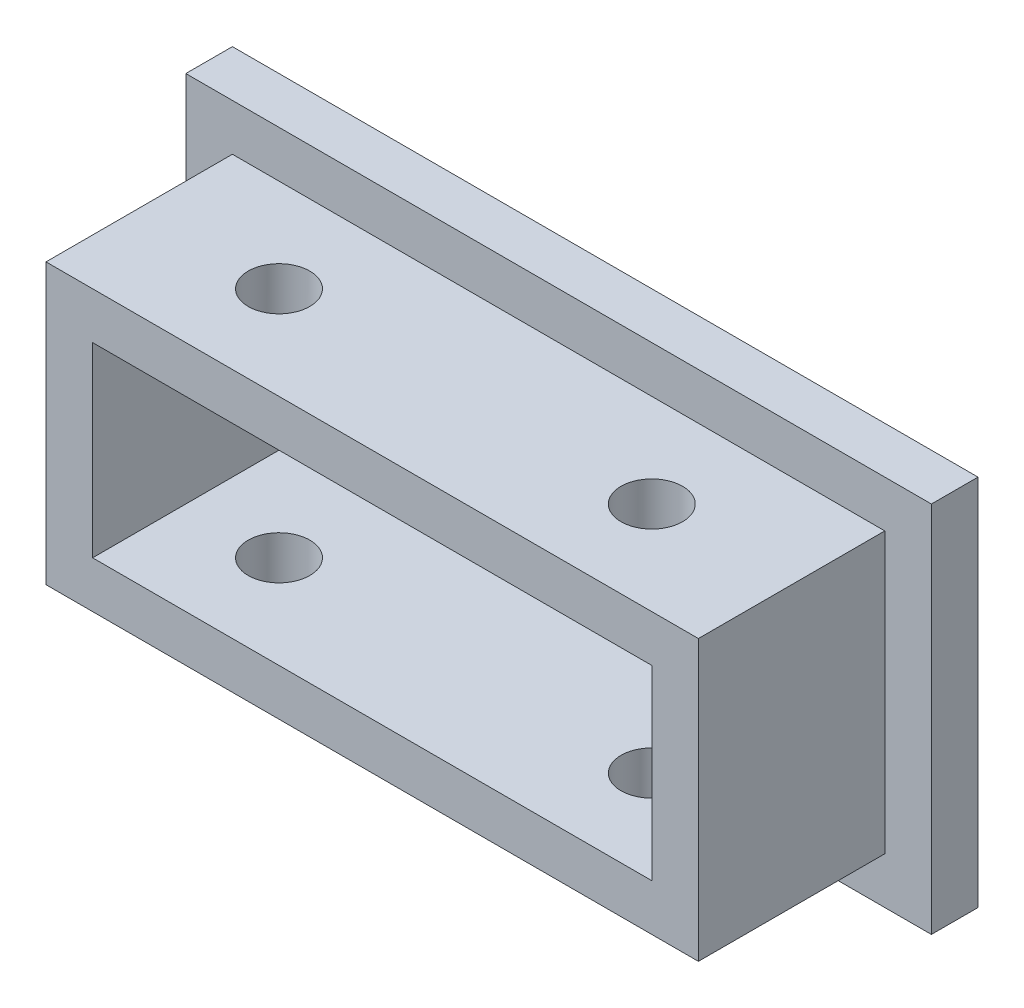
ISO-10303-21;
HEADER;
FILE_DESCRIPTION(('STEP AP214'),'2;1');
FILE_NAME('part.step','',(''),(''),'','','');
FILE_SCHEMA(('AUTOMOTIVE_DESIGN { 1 0 10303 214 1 1 1 1 }'));
ENDSEC;
DATA;
#1=APPLICATION_CONTEXT('core data for automotive mechanical design processes');
#2=APPLICATION_PROTOCOL_DEFINITION('international standard','automotive_design',2000,#1);
#3=PRODUCT_CONTEXT('',#1,'mechanical');
#4=PRODUCT('Part','Part','',(#3));
#5=PRODUCT_RELATED_PRODUCT_CATEGORY('part','',(#4));
#6=PRODUCT_DEFINITION_FORMATION('','',#4);
#7=PRODUCT_DEFINITION_CONTEXT('part definition',#1,'design');
#8=PRODUCT_DEFINITION('design','',#6,#7);
#9=PRODUCT_DEFINITION_SHAPE('','',#8);
#10=(LENGTH_UNIT() NAMED_UNIT(*) SI_UNIT(.MILLI.,.METRE.));
#11=(NAMED_UNIT(*) PLANE_ANGLE_UNIT() SI_UNIT($,.RADIAN.));
#12=(NAMED_UNIT(*) SI_UNIT($,.STERADIAN.) SOLID_ANGLE_UNIT());
#13=UNCERTAINTY_MEASURE_WITH_UNIT(LENGTH_MEASURE(1.E-05),#10,'distance_accuracy_value','');
#14=(GEOMETRIC_REPRESENTATION_CONTEXT(3) GLOBAL_UNCERTAINTY_ASSIGNED_CONTEXT((#13)) GLOBAL_UNIT_ASSIGNED_CONTEXT((#10,
#11,#12)) REPRESENTATION_CONTEXT('',''));
#15=CARTESIAN_POINT('',(0.,0.,0.));
#16=DIRECTION('',(0.,0.,1.));
#17=DIRECTION('',(1.,0.,0.));
#18=AXIS2_PLACEMENT_3D('',#15,#16,#17);
#19=CARTESIAN_POINT('',(0.,0.,12.7));
#20=DIRECTION('',(0.,0.,1.));
#21=DIRECTION('',(1.,0.,0.));
#22=AXIS2_PLACEMENT_3D('',#19,#20,#21);
#23=PLANE('',#22);
#24=DIRECTION('',(0.,1.,0.));
#25=VECTOR('',#24,1.);
#26=CARTESIAN_POINT('',(22.225,9.525,12.7));
#27=LINE('',#26,#25);
#28=CARTESIAN_POINT('',(22.225,-9.52500000000001,12.7));
#29=VERTEX_POINT('',#28);
#30=CARTESIAN_POINT('',(22.225,9.525,12.7));
#31=VERTEX_POINT('',#30);
#32=EDGE_CURVE('E110',#29,#31,#27,.T.);
#33=ORIENTED_EDGE('',*,*,#32,.T.);
#34=DIRECTION('',(-1.,0.,0.));
#35=VECTOR('',#34,1.);
#36=CARTESIAN_POINT('',(-22.225,9.525,12.7));
#37=LINE('',#36,#35);
#38=CARTESIAN_POINT('',(-22.225,9.525,12.7));
#39=VERTEX_POINT('',#38);
#40=EDGE_CURVE('E103',#31,#39,#37,.T.);
#41=ORIENTED_EDGE('',*,*,#40,.T.);
#42=DIRECTION('',(0.,-1.,0.));
#43=VECTOR('',#42,1.);
#44=CARTESIAN_POINT('',(-22.225,9.525,12.7));
#45=LINE('',#44,#43);
#46=CARTESIAN_POINT('',(-22.225,-9.52500000000001,12.7));
#47=VERTEX_POINT('',#46);
#48=EDGE_CURVE('E107',#39,#47,#45,.T.);
#49=ORIENTED_EDGE('',*,*,#48,.T.);
#50=DIRECTION('',(1.,0.,0.));
#51=VECTOR('',#50,1.);
#52=CARTESIAN_POINT('',(-22.225,-9.52500000000001,12.7));
#53=LINE('',#52,#51);
#54=EDGE_CURVE('E66',#47,#29,#53,.T.);
#55=ORIENTED_EDGE('',*,*,#54,.T.);
#56=EDGE_LOOP('',(#33,#41,#49,#55));
#57=FACE_BOUND('',#56,.T.);
#58=DIRECTION('',(1.,0.,0.));
#59=VECTOR('',#58,1.);
#60=CARTESIAN_POINT('',(-19.05,-6.35000000000001,12.7));
#61=LINE('',#60,#59);
#62=CARTESIAN_POINT('',(-19.05,-6.35000000000001,12.7));
#63=VERTEX_POINT('',#62);
#64=CARTESIAN_POINT('',(19.05,-6.35000000000001,12.7));
#65=VERTEX_POINT('',#64);
#66=EDGE_CURVE('E187',#63,#65,#61,.T.);
#67=ORIENTED_EDGE('',*,*,#66,.F.);
#68=DIRECTION('',(0.,-1.,0.));
#69=VECTOR('',#68,1.);
#70=CARTESIAN_POINT('',(-19.05,6.35,12.7));
#71=LINE('',#70,#69);
#72=CARTESIAN_POINT('',(-19.05,6.35,12.7));
#73=VERTEX_POINT('',#72);
#74=EDGE_CURVE('E183',#73,#63,#71,.T.);
#75=ORIENTED_EDGE('',*,*,#74,.F.);
#76=DIRECTION('',(-1.,0.,0.));
#77=VECTOR('',#76,1.);
#78=CARTESIAN_POINT('',(-19.05,6.35,12.7));
#79=LINE('',#78,#77);
#80=CARTESIAN_POINT('',(19.05,6.35,12.7));
#81=VERTEX_POINT('',#80);
#82=EDGE_CURVE('E87',#81,#73,#79,.T.);
#83=ORIENTED_EDGE('',*,*,#82,.F.);
#84=DIRECTION('',(0.,1.,0.));
#85=VECTOR('',#84,1.);
#86=CARTESIAN_POINT('',(19.05,6.35,12.7));
#87=LINE('',#86,#85);
#88=EDGE_CURVE('E191',#65,#81,#87,.T.);
#89=ORIENTED_EDGE('',*,*,#88,.F.);
#90=EDGE_LOOP('',(#67,#75,#83,#89));
#91=FACE_BOUND('',#90,.T.);
#92=ADVANCED_FACE('F39',(#57,#91),#23,.T.);
#93=CARTESIAN_POINT('',(22.225,9.525,12.7));
#94=DIRECTION('',(-1.,0.,0.));
#95=DIRECTION('',(0.,-1.,0.));
#96=AXIS2_PLACEMENT_3D('',#93,#94,#95);
#97=PLANE('',#96);
#98=DIRECTION('',(0.,1.,0.));
#99=VECTOR('',#98,1.);
#100=CARTESIAN_POINT('',(22.225,9.525,0.));
#101=LINE('',#100,#99);
#102=CARTESIAN_POINT('',(22.225,-9.52500000000001,0.));
#103=VERTEX_POINT('',#102);
#104=CARTESIAN_POINT('',(22.225,9.525,0.));
#105=VERTEX_POINT('',#104);
#106=EDGE_CURVE('E131',#103,#105,#101,.T.);
#107=ORIENTED_EDGE('',*,*,#106,.T.);
#108=DIRECTION('',(0.,0.,-1.));
#109=VECTOR('',#108,1.);
#110=CARTESIAN_POINT('',(22.225,9.525,12.7));
#111=LINE('',#110,#109);
#112=EDGE_CURVE('E11',#31,#105,#111,.T.);
#113=ORIENTED_EDGE('',*,*,#112,.F.);
#114=ORIENTED_EDGE('',*,*,#32,.F.);
#115=DIRECTION('',(0.,0.,-1.));
#116=VECTOR('',#115,1.);
#117=CARTESIAN_POINT('',(22.225,-9.52500000000001,12.7));
#118=LINE('',#117,#116);
#119=EDGE_CURVE('E127',#29,#103,#118,.T.);
#120=ORIENTED_EDGE('',*,*,#119,.T.);
#121=EDGE_LOOP('',(#107,#113,#114,#120));
#122=FACE_BOUND('',#121,.T.);
#123=ADVANCED_FACE('F41',(#122),#97,.F.);
#124=CARTESIAN_POINT('',(-22.225,9.525,12.7));
#125=DIRECTION('',(0.,-1.,0.));
#126=DIRECTION('',(0.,0.,-1.));
#127=AXIS2_PLACEMENT_3D('',#124,#125,#126);
#128=PLANE('',#127);
#129=CARTESIAN_POINT('',(-12.7,9.525,6.35));
#130=DIRECTION('',(0.,1.,0.));
#131=DIRECTION('',(0.,0.,1.));
#132=AXIS2_PLACEMENT_3D('',#129,#130,#131);
#133=CIRCLE('',#132,2.0955);
#134=CARTESIAN_POINT('',(-12.7,9.525,8.4455));
#135=VERTEX_POINT('',#134);
#136=EDGE_CURVE('E160',#135,#135,#133,.T.);
#137=ORIENTED_EDGE('',*,*,#136,.F.);
#138=EDGE_LOOP('',(#137));
#139=FACE_BOUND('',#138,.T.);
#140=CARTESIAN_POINT('',(12.7,9.525,6.35));
#141=DIRECTION('',(0.,1.,0.));
#142=DIRECTION('',(0.,0.,-1.));
#143=AXIS2_PLACEMENT_3D('',#140,#141,#142);
#144=CIRCLE('',#143,2.0955);
#145=CARTESIAN_POINT('',(12.7,9.525,4.2545));
#146=VERTEX_POINT('',#145);
#147=EDGE_CURVE('E170',#146,#146,#144,.T.);
#148=ORIENTED_EDGE('',*,*,#147,.F.);
#149=EDGE_LOOP('',(#148));
#150=FACE_BOUND('',#149,.T.);
#151=DIRECTION('',(-1.,0.,0.));
#152=VECTOR('',#151,1.);
#153=CARTESIAN_POINT('',(-22.225,9.525,0.));
#154=LINE('',#153,#152);
#155=CARTESIAN_POINT('',(-22.225,9.525,0.));
#156=VERTEX_POINT('',#155);
#157=EDGE_CURVE('E117',#105,#156,#154,.T.);
#158=ORIENTED_EDGE('',*,*,#157,.T.);
#159=DIRECTION('',(0.,0.,-1.));
#160=VECTOR('',#159,1.);
#161=CARTESIAN_POINT('',(-22.225,9.525,12.7));
#162=LINE('',#161,#160);
#163=EDGE_CURVE('E49',#39,#156,#162,.T.);
#164=ORIENTED_EDGE('',*,*,#163,.F.);
#165=ORIENTED_EDGE('',*,*,#40,.F.);
#166=ORIENTED_EDGE('',*,*,#112,.T.);
#167=EDGE_LOOP('',(#158,#164,#165,#166));
#168=FACE_BOUND('',#167,.T.);
#169=ADVANCED_FACE('F116',(#139,#150,#168),#128,.F.);
#170=CARTESIAN_POINT('',(-22.225,9.525,12.7));
#171=DIRECTION('',(1.,0.,0.));
#172=DIRECTION('',(0.,1.,0.));
#173=AXIS2_PLACEMENT_3D('',#170,#171,#172);
#174=PLANE('',#173);
#175=DIRECTION('',(0.,-1.,0.));
#176=VECTOR('',#175,1.);
#177=CARTESIAN_POINT('',(-22.225,9.525,0.));
#178=LINE('',#177,#176);
#179=CARTESIAN_POINT('',(-22.225,-9.52500000000001,0.));
#180=VERTEX_POINT('',#179);
#181=EDGE_CURVE('E79',#156,#180,#178,.T.);
#182=ORIENTED_EDGE('',*,*,#181,.T.);
#183=DIRECTION('',(0.,0.,-1.));
#184=VECTOR('',#183,1.);
#185=CARTESIAN_POINT('',(-22.225,-9.52500000000001,12.7));
#186=LINE('',#185,#184);
#187=EDGE_CURVE('E120',#47,#180,#186,.T.);
#188=ORIENTED_EDGE('',*,*,#187,.F.);
#189=ORIENTED_EDGE('',*,*,#48,.F.);
#190=ORIENTED_EDGE('',*,*,#163,.T.);
#191=EDGE_LOOP('',(#182,#188,#189,#190));
#192=FACE_BOUND('',#191,.T.);
#193=ADVANCED_FACE('F122',(#192),#174,.F.);
#194=CARTESIAN_POINT('',(-22.225,-9.52500000000001,12.7));
#195=DIRECTION('',(0.,1.,0.));
#196=DIRECTION('',(0.,0.,1.));
#197=AXIS2_PLACEMENT_3D('',#194,#195,#196);
#198=PLANE('',#197);
#199=CARTESIAN_POINT('',(-12.7,-9.52500000000001,6.35));
#200=DIRECTION('',(0.,1.,0.));
#201=DIRECTION('',(0.,0.,1.));
#202=AXIS2_PLACEMENT_3D('',#199,#200,#201);
#203=CIRCLE('',#202,2.0955);
#204=CARTESIAN_POINT('',(-12.7,-9.52500000000001,8.4455));
#205=VERTEX_POINT('',#204);
#206=EDGE_CURVE('E152',#205,#205,#203,.F.);
#207=ORIENTED_EDGE('',*,*,#206,.F.);
#208=EDGE_LOOP('',(#207));
#209=FACE_BOUND('',#208,.T.);
#210=CARTESIAN_POINT('',(12.7,-9.52500000000001,6.35));
#211=DIRECTION('',(0.,1.,0.));
#212=DIRECTION('',(0.,0.,1.));
#213=AXIS2_PLACEMENT_3D('',#210,#211,#212);
#214=CIRCLE('',#213,2.0955);
#215=CARTESIAN_POINT('',(12.7,-9.52500000000001,8.4455));
#216=VERTEX_POINT('',#215);
#217=EDGE_CURVE('E166',#216,#216,#214,.F.);
#218=ORIENTED_EDGE('',*,*,#217,.F.);
#219=EDGE_LOOP('',(#218));
#220=FACE_BOUND('',#219,.T.);
#221=DIRECTION('',(1.,0.,0.));
#222=VECTOR('',#221,1.);
#223=CARTESIAN_POINT('',(-22.225,-9.52500000000001,0.));
#224=LINE('',#223,#222);
#225=EDGE_CURVE('E140',#180,#103,#224,.T.);
#226=ORIENTED_EDGE('',*,*,#225,.T.);
#227=ORIENTED_EDGE('',*,*,#119,.F.);
#228=ORIENTED_EDGE('',*,*,#54,.F.);
#229=ORIENTED_EDGE('',*,*,#187,.T.);
#230=EDGE_LOOP('',(#226,#227,#228,#229));
#231=FACE_BOUND('',#230,.T.);
#232=ADVANCED_FACE('F257',(#209,#220,#231),#198,.F.);
#233=CARTESIAN_POINT('',(-19.05,6.35,12.7));
#234=DIRECTION('',(1.,0.,0.));
#235=DIRECTION('',(0.,0.,-1.));
#236=AXIS2_PLACEMENT_3D('',#233,#234,#235);
#237=PLANE('',#236);
#238=DIRECTION('',(0.,-1.,0.));
#239=VECTOR('',#238,1.);
#240=CARTESIAN_POINT('',(-19.05,6.35,0.));
#241=LINE('',#240,#239);
#242=CARTESIAN_POINT('',(-19.05,6.35,0.));
#243=VERTEX_POINT('',#242);
#244=CARTESIAN_POINT('',(-19.05,-6.35000000000001,0.));
#245=VERTEX_POINT('',#244);
#246=EDGE_CURVE('E182',#243,#245,#241,.T.);
#247=ORIENTED_EDGE('',*,*,#246,.F.);
#248=DIRECTION('',(0.,0.,-1.));
#249=VECTOR('',#248,1.);
#250=CARTESIAN_POINT('',(-19.05,6.35,12.7));
#251=LINE('',#250,#249);
#252=EDGE_CURVE('E196',#73,#243,#251,.T.);
#253=ORIENTED_EDGE('',*,*,#252,.F.);
#254=ORIENTED_EDGE('',*,*,#74,.T.);
#255=DIRECTION('',(0.,0.,-1.));
#256=VECTOR('',#255,1.);
#257=CARTESIAN_POINT('',(-19.05,-6.35000000000001,12.7));
#258=LINE('',#257,#256);
#259=EDGE_CURVE('E135',#63,#245,#258,.T.);
#260=ORIENTED_EDGE('',*,*,#259,.T.);
#261=EDGE_LOOP('',(#247,#253,#254,#260));
#262=FACE_BOUND('',#261,.T.);
#263=ADVANCED_FACE('F246',(#262),#237,.T.);
#264=CARTESIAN_POINT('',(-19.05,-6.35000000000001,12.7));
#265=DIRECTION('',(0.,1.,0.));
#266=DIRECTION('',(0.,0.,1.));
#267=AXIS2_PLACEMENT_3D('',#264,#265,#266);
#268=PLANE('',#267);
#269=CARTESIAN_POINT('',(-12.7,-6.35,6.35));
#270=DIRECTION('',(0.,1.,0.));
#271=DIRECTION('',(0.,0.,1.));
#272=AXIS2_PLACEMENT_3D('',#269,#270,#271);
#273=CIRCLE('',#272,2.0955);
#274=CARTESIAN_POINT('',(-12.7,-6.35,8.4455));
#275=VERTEX_POINT('',#274);
#276=EDGE_CURVE('E178',#275,#275,#273,.T.);
#277=ORIENTED_EDGE('',*,*,#276,.F.);
#278=EDGE_LOOP('',(#277));
#279=FACE_BOUND('',#278,.T.);
#280=CARTESIAN_POINT('',(12.7,-6.35,6.35));
#281=DIRECTION('',(0.,1.,0.));
#282=DIRECTION('',(0.,0.,1.));
#283=AXIS2_PLACEMENT_3D('',#280,#281,#282);
#284=CIRCLE('',#283,2.0955);
#285=CARTESIAN_POINT('',(12.7,-6.35,8.4455));
#286=VERTEX_POINT('',#285);
#287=EDGE_CURVE('E151',#286,#286,#284,.T.);
#288=ORIENTED_EDGE('',*,*,#287,.F.);
#289=EDGE_LOOP('',(#288));
#290=FACE_BOUND('',#289,.T.);
#291=DIRECTION('',(1.,0.,0.));
#292=VECTOR('',#291,1.);
#293=CARTESIAN_POINT('',(-19.05,-6.35000000000001,0.));
#294=LINE('',#293,#292);
#295=CARTESIAN_POINT('',(19.05,-6.35000000000001,0.));
#296=VERTEX_POINT('',#295);
#297=EDGE_CURVE('E200',#245,#296,#294,.T.);
#298=ORIENTED_EDGE('',*,*,#297,.F.);
#299=ORIENTED_EDGE('',*,*,#259,.F.);
#300=ORIENTED_EDGE('',*,*,#66,.T.);
#301=DIRECTION('',(0.,0.,-1.));
#302=VECTOR('',#301,1.);
#303=CARTESIAN_POINT('',(19.05,-6.35000000000001,12.7));
#304=LINE('',#303,#302);
#305=EDGE_CURVE('E215',#65,#296,#304,.T.);
#306=ORIENTED_EDGE('',*,*,#305,.T.);
#307=EDGE_LOOP('',(#298,#299,#300,#306));
#308=FACE_BOUND('',#307,.T.);
#309=ADVANCED_FACE('F248',(#279,#290,#308),#268,.T.);
#310=CARTESIAN_POINT('',(19.05,6.35,12.7));
#311=DIRECTION('',(-1.,0.,0.));
#312=DIRECTION('',(0.,0.,1.));
#313=AXIS2_PLACEMENT_3D('',#310,#311,#312);
#314=PLANE('',#313);
#315=DIRECTION('',(0.,1.,0.));
#316=VECTOR('',#315,1.);
#317=CARTESIAN_POINT('',(19.05,6.35,0.));
#318=LINE('',#317,#316);
#319=CARTESIAN_POINT('',(19.05,6.35,0.));
#320=VERTEX_POINT('',#319);
#321=EDGE_CURVE('E204',#296,#320,#318,.T.);
#322=ORIENTED_EDGE('',*,*,#321,.F.);
#323=ORIENTED_EDGE('',*,*,#305,.F.);
#324=ORIENTED_EDGE('',*,*,#88,.T.);
#325=DIRECTION('',(0.,0.,-1.));
#326=VECTOR('',#325,1.);
#327=CARTESIAN_POINT('',(19.05,6.35,12.7));
#328=LINE('',#327,#326);
#329=EDGE_CURVE('E57',#81,#320,#328,.T.);
#330=ORIENTED_EDGE('',*,*,#329,.T.);
#331=EDGE_LOOP('',(#322,#323,#324,#330));
#332=FACE_BOUND('',#331,.T.);
#333=ADVANCED_FACE('F232',(#332),#314,.T.);
#334=CARTESIAN_POINT('',(-19.05,6.35,12.7));
#335=DIRECTION('',(0.,-1.,0.));
#336=DIRECTION('',(0.,0.,-1.));
#337=AXIS2_PLACEMENT_3D('',#334,#335,#336);
#338=PLANE('',#337);
#339=CARTESIAN_POINT('',(-12.7,6.34999999999999,6.35));
#340=DIRECTION('',(0.,-1.,0.));
#341=DIRECTION('',(0.,0.,-1.));
#342=AXIS2_PLACEMENT_3D('',#339,#340,#341);
#343=CIRCLE('',#342,2.0955);
#344=CARTESIAN_POINT('',(-12.7,6.34999999999999,4.2545));
#345=VERTEX_POINT('',#344);
#346=EDGE_CURVE('E43',#345,#345,#343,.T.);
#347=ORIENTED_EDGE('',*,*,#346,.F.);
#348=EDGE_LOOP('',(#347));
#349=FACE_BOUND('',#348,.T.);
#350=CARTESIAN_POINT('',(12.7,6.34999999999999,6.35));
#351=DIRECTION('',(0.,-1.,0.));
#352=DIRECTION('',(0.,0.,-1.));
#353=AXIS2_PLACEMENT_3D('',#350,#351,#352);
#354=CIRCLE('',#353,2.0955);
#355=CARTESIAN_POINT('',(12.7,6.34999999999999,4.2545));
#356=VERTEX_POINT('',#355);
#357=EDGE_CURVE('E148',#356,#356,#354,.T.);
#358=ORIENTED_EDGE('',*,*,#357,.F.);
#359=EDGE_LOOP('',(#358));
#360=FACE_BOUND('',#359,.T.);
#361=DIRECTION('',(-1.,0.,0.));
#362=VECTOR('',#361,1.);
#363=CARTESIAN_POINT('',(-19.05,6.35,0.));
#364=LINE('',#363,#362);
#365=EDGE_CURVE('E188',#320,#243,#364,.T.);
#366=ORIENTED_EDGE('',*,*,#365,.F.);
#367=ORIENTED_EDGE('',*,*,#329,.F.);
#368=ORIENTED_EDGE('',*,*,#82,.T.);
#369=ORIENTED_EDGE('',*,*,#252,.T.);
#370=EDGE_LOOP('',(#366,#367,#368,#369));
#371=FACE_BOUND('',#370,.T.);
#372=ADVANCED_FACE('F228',(#349,#360,#371),#338,.T.);
#373=CARTESIAN_POINT('',(12.7,-15.4519690399056,6.35));
#374=DIRECTION('',(0.,1.,0.));
#375=DIRECTION('',(0.,0.,1.));
#376=AXIS2_PLACEMENT_3D('',#373,#374,#375);
#377=CYLINDRICAL_SURFACE('',#376,2.0955);
#378=ORIENTED_EDGE('',*,*,#357,.T.);
#379=EDGE_LOOP('',(#378));
#380=FACE_BOUND('',#379,.T.);
#381=ORIENTED_EDGE('',*,*,#147,.T.);
#382=EDGE_LOOP('',(#381));
#383=FACE_BOUND('',#382,.T.);
#384=ADVANCED_FACE('F231',(#380,#383),#377,.F.);
#385=CARTESIAN_POINT('',(-12.7,-15.4519690399056,6.35));
#386=DIRECTION('',(0.,1.,0.));
#387=DIRECTION('',(0.,0.,1.));
#388=AXIS2_PLACEMENT_3D('',#385,#386,#387);
#389=CYLINDRICAL_SURFACE('',#388,2.0955);
#390=ORIENTED_EDGE('',*,*,#346,.T.);
#391=EDGE_LOOP('',(#390));
#392=FACE_BOUND('',#391,.T.);
#393=ORIENTED_EDGE('',*,*,#136,.T.);
#394=EDGE_LOOP('',(#393));
#395=FACE_BOUND('',#394,.T.);
#396=ADVANCED_FACE('F225',(#392,#395),#389,.F.);
#397=ORIENTED_EDGE('',*,*,#287,.T.);
#398=EDGE_LOOP('',(#397));
#399=FACE_BOUND('',#398,.T.);
#400=ORIENTED_EDGE('',*,*,#217,.T.);
#401=EDGE_LOOP('',(#400));
#402=FACE_BOUND('',#401,.T.);
#403=ADVANCED_FACE('F282',(#399,#402),#377,.F.);
#404=ORIENTED_EDGE('',*,*,#276,.T.);
#405=EDGE_LOOP('',(#404));
#406=FACE_BOUND('',#405,.T.);
#407=ORIENTED_EDGE('',*,*,#206,.T.);
#408=EDGE_LOOP('',(#407));
#409=FACE_BOUND('',#408,.T.);
#410=ADVANCED_FACE('F287',(#406,#409),#389,.F.);
#411=CARTESIAN_POINT('',(0.,0.,0.));
#412=DIRECTION('',(0.,0.,-1.));
#413=DIRECTION('',(-1.,0.,0.));
#414=AXIS2_PLACEMENT_3D('',#411,#412,#413);
#415=PLANE('',#414);
#416=ORIENTED_EDGE('',*,*,#365,.T.);
#417=ORIENTED_EDGE('',*,*,#246,.T.);
#418=ORIENTED_EDGE('',*,*,#297,.T.);
#419=ORIENTED_EDGE('',*,*,#321,.T.);
#420=EDGE_LOOP('',(#416,#417,#418,#419));
#421=FACE_BOUND('',#420,.T.);
#422=ADVANCED_FACE('F238',(#421),#415,.F.);
#423=CARTESIAN_POINT('',(-25.4,12.7,-3.175));
#424=DIRECTION('',(1.,0.,0.));
#425=DIRECTION('',(0.,0.,-1.));
#426=AXIS2_PLACEMENT_3D('',#423,#424,#425);
#427=PLANE('',#426);
#428=DIRECTION('',(0.,1.,0.));
#429=VECTOR('',#428,1.);
#430=CARTESIAN_POINT('',(-25.4,12.7,0.));
#431=LINE('',#430,#429);
#432=CARTESIAN_POINT('',(-25.4,-12.7,0.));
#433=VERTEX_POINT('',#432);
#434=CARTESIAN_POINT('',(-25.4,12.7,0.));
#435=VERTEX_POINT('',#434);
#436=EDGE_CURVE('E358',#433,#435,#431,.T.);
#437=ORIENTED_EDGE('',*,*,#436,.T.);
#438=DIRECTION('',(0.,0.,1.));
#439=VECTOR('',#438,1.);
#440=CARTESIAN_POINT('',(-25.4,12.7,-3.175));
#441=LINE('',#440,#439);
#442=CARTESIAN_POINT('',(-25.4,12.7,-3.175));
#443=VERTEX_POINT('',#442);
#444=EDGE_CURVE('E174',#443,#435,#441,.T.);
#445=ORIENTED_EDGE('',*,*,#444,.F.);
#446=DIRECTION('',(0.,1.,0.));
#447=VECTOR('',#446,1.);
#448=CARTESIAN_POINT('',(-25.4,12.7,-3.175));
#449=LINE('',#448,#447);
#450=CARTESIAN_POINT('',(-25.4,-12.7,-3.175));
#451=VERTEX_POINT('',#450);
#452=EDGE_CURVE('E344',#451,#443,#449,.T.);
#453=ORIENTED_EDGE('',*,*,#452,.F.);
#454=DIRECTION('',(0.,0.,1.));
#455=VECTOR('',#454,1.);
#456=CARTESIAN_POINT('',(-25.4,-12.7,-3.175));
#457=LINE('',#456,#455);
#458=EDGE_CURVE('E367',#451,#433,#457,.T.);
#459=ORIENTED_EDGE('',*,*,#458,.T.);
#460=EDGE_LOOP('',(#437,#445,#453,#459));
#461=FACE_BOUND('',#460,.T.);
#462=ADVANCED_FACE('F356',(#461),#427,.F.);
#463=CARTESIAN_POINT('',(25.4,12.7,-3.175));
#464=DIRECTION('',(0.,-1.,0.));
#465=DIRECTION('',(0.,0.,-1.));
#466=AXIS2_PLACEMENT_3D('',#463,#464,#465);
#467=PLANE('',#466);
#468=DIRECTION('',(1.,0.,0.));
#469=VECTOR('',#468,1.);
#470=CARTESIAN_POINT('',(25.4,12.7,0.));
#471=LINE('',#470,#469);
#472=CARTESIAN_POINT('',(25.4,12.7,0.));
#473=VERTEX_POINT('',#472);
#474=EDGE_CURVE('E375',#435,#473,#471,.T.);
#475=ORIENTED_EDGE('',*,*,#474,.T.);
#476=DIRECTION('',(0.,0.,1.));
#477=VECTOR('',#476,1.);
#478=CARTESIAN_POINT('',(25.4,12.7,-3.175));
#479=LINE('',#478,#477);
#480=CARTESIAN_POINT('',(25.4,12.7,-3.175));
#481=VERTEX_POINT('',#480);
#482=EDGE_CURVE('E339',#481,#473,#479,.T.);
#483=ORIENTED_EDGE('',*,*,#482,.F.);
#484=DIRECTION('',(1.,0.,0.));
#485=VECTOR('',#484,1.);
#486=CARTESIAN_POINT('',(25.4,12.7,-3.175));
#487=LINE('',#486,#485);
#488=EDGE_CURVE('E333',#443,#481,#487,.T.);
#489=ORIENTED_EDGE('',*,*,#488,.F.);
#490=ORIENTED_EDGE('',*,*,#444,.T.);
#491=EDGE_LOOP('',(#475,#483,#489,#490));
#492=FACE_BOUND('',#491,.T.);
#493=ADVANCED_FACE('F335',(#492),#467,.F.);
#494=CARTESIAN_POINT('',(25.4,12.7,-3.175));
#495=DIRECTION('',(-1.,0.,0.));
#496=DIRECTION('',(0.,0.,1.));
#497=AXIS2_PLACEMENT_3D('',#494,#495,#496);
#498=PLANE('',#497);
#499=DIRECTION('',(0.,-1.,0.));
#500=VECTOR('',#499,1.);
#501=CARTESIAN_POINT('',(25.4,12.7,0.));
#502=LINE('',#501,#500);
#503=CARTESIAN_POINT('',(25.4,-12.7,0.));
#504=VERTEX_POINT('',#503);
#505=EDGE_CURVE('E372',#473,#504,#502,.T.);
#506=ORIENTED_EDGE('',*,*,#505,.T.);
#507=DIRECTION('',(0.,0.,1.));
#508=VECTOR('',#507,1.);
#509=CARTESIAN_POINT('',(25.4,-12.7,-3.175));
#510=LINE('',#509,#508);
#511=CARTESIAN_POINT('',(25.4,-12.7,-3.175));
#512=VERTEX_POINT('',#511);
#513=EDGE_CURVE('E361',#512,#504,#510,.T.);
#514=ORIENTED_EDGE('',*,*,#513,.F.);
#515=DIRECTION('',(0.,-1.,0.));
#516=VECTOR('',#515,1.);
#517=CARTESIAN_POINT('',(25.4,12.7,-3.175));
#518=LINE('',#517,#516);
#519=EDGE_CURVE('E343',#481,#512,#518,.T.);
#520=ORIENTED_EDGE('',*,*,#519,.F.);
#521=ORIENTED_EDGE('',*,*,#482,.T.);
#522=EDGE_LOOP('',(#506,#514,#520,#521));
#523=FACE_BOUND('',#522,.T.);
#524=ADVANCED_FACE('F385',(#523),#498,.F.);
#525=CARTESIAN_POINT('',(25.4,-12.7,-3.175));
#526=DIRECTION('',(0.,1.,0.));
#527=DIRECTION('',(0.,0.,1.));
#528=AXIS2_PLACEMENT_3D('',#525,#526,#527);
#529=PLANE('',#528);
#530=DIRECTION('',(-1.,0.,0.));
#531=VECTOR('',#530,1.);
#532=CARTESIAN_POINT('',(25.4,-12.7,0.));
#533=LINE('',#532,#531);
#534=EDGE_CURVE('E354',#504,#433,#533,.T.);
#535=ORIENTED_EDGE('',*,*,#534,.T.);
#536=ORIENTED_EDGE('',*,*,#458,.F.);
#537=DIRECTION('',(-1.,0.,0.));
#538=VECTOR('',#537,1.);
#539=CARTESIAN_POINT('',(25.4,-12.7,-3.175));
#540=LINE('',#539,#538);
#541=EDGE_CURVE('E349',#512,#451,#540,.T.);
#542=ORIENTED_EDGE('',*,*,#541,.F.);
#543=ORIENTED_EDGE('',*,*,#513,.T.);
#544=EDGE_LOOP('',(#535,#536,#542,#543));
#545=FACE_BOUND('',#544,.T.);
#546=ADVANCED_FACE('F389',(#545),#529,.F.);
#547=CARTESIAN_POINT('',(0.,0.,-3.175));
#548=DIRECTION('',(0.,0.,-1.));
#549=DIRECTION('',(-1.,0.,0.));
#550=AXIS2_PLACEMENT_3D('',#547,#548,#549);
#551=PLANE('',#550);
#552=ORIENTED_EDGE('',*,*,#452,.T.);
#553=ORIENTED_EDGE('',*,*,#488,.T.);
#554=ORIENTED_EDGE('',*,*,#519,.T.);
#555=ORIENTED_EDGE('',*,*,#541,.T.);
#556=EDGE_LOOP('',(#552,#553,#554,#555));
#557=FACE_BOUND('',#556,.T.);
#558=ADVANCED_FACE('F347',(#557),#551,.T.);
#559=ORIENTED_EDGE('',*,*,#106,.F.);
#560=ORIENTED_EDGE('',*,*,#225,.F.);
#561=ORIENTED_EDGE('',*,*,#181,.F.);
#562=ORIENTED_EDGE('',*,*,#157,.F.);
#563=EDGE_LOOP('',(#559,#560,#561,#562));
#564=FACE_BOUND('',#563,.T.);
#565=ORIENTED_EDGE('',*,*,#436,.F.);
#566=ORIENTED_EDGE('',*,*,#534,.F.);
#567=ORIENTED_EDGE('',*,*,#505,.F.);
#568=ORIENTED_EDGE('',*,*,#474,.F.);
#569=EDGE_LOOP('',(#565,#566,#567,#568));
#570=FACE_BOUND('',#569,.T.);
#571=ADVANCED_FACE('F391',(#564,#570),#415,.F.);
#572=CLOSED_SHELL('',(#92,#123,#169,#193,#232,#263,#309,#333,#372,#384,#396,#403,#410,#422,#462,
#493,#524,#546,#558,#571));
#573=MANIFOLD_SOLID_BREP('B2',#572);
#574=ADVANCED_BREP_SHAPE_REPRESENTATION('',(#18,#573),#14);
#575=SHAPE_DEFINITION_REPRESENTATION(#9,#574);
ENDSEC;
END-ISO-10303-21;
